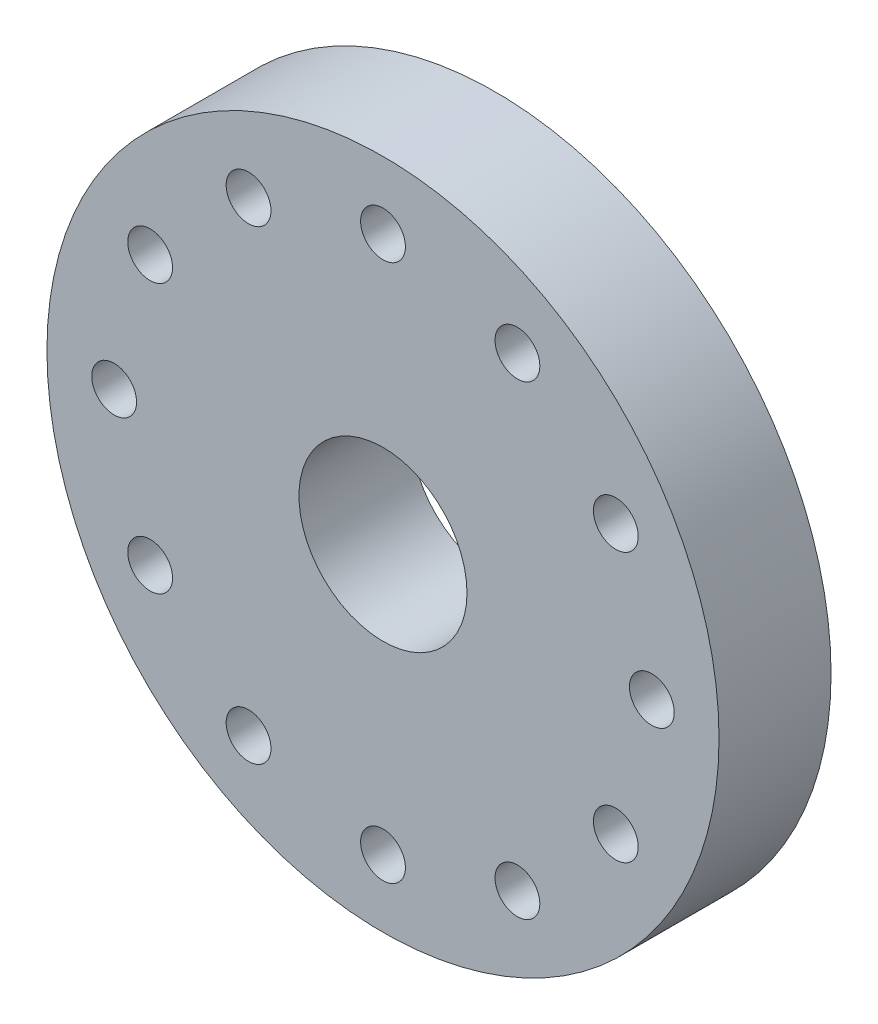
ISO-10303-21;
HEADER;
FILE_DESCRIPTION(('STEP AP214'),'2;1');
FILE_NAME('part.step','',(''),(''),'','','');
FILE_SCHEMA(('AUTOMOTIVE_DESIGN { 1 0 10303 214 1 1 1 1 }'));
ENDSEC;
DATA;
#1=APPLICATION_CONTEXT('core data for automotive mechanical design processes');
#2=APPLICATION_PROTOCOL_DEFINITION('international standard','automotive_design',2000,#1);
#3=PRODUCT_CONTEXT('',#1,'mechanical');
#4=PRODUCT('Part','Part','',(#3));
#5=PRODUCT_RELATED_PRODUCT_CATEGORY('part','',(#4));
#6=PRODUCT_DEFINITION_FORMATION('','',#4);
#7=PRODUCT_DEFINITION_CONTEXT('part definition',#1,'design');
#8=PRODUCT_DEFINITION('design','',#6,#7);
#9=PRODUCT_DEFINITION_SHAPE('','',#8);
#10=(LENGTH_UNIT() NAMED_UNIT(*) SI_UNIT(.MILLI.,.METRE.));
#11=(NAMED_UNIT(*) PLANE_ANGLE_UNIT() SI_UNIT($,.RADIAN.));
#12=(NAMED_UNIT(*) SI_UNIT($,.STERADIAN.) SOLID_ANGLE_UNIT());
#13=UNCERTAINTY_MEASURE_WITH_UNIT(LENGTH_MEASURE(1.E-05),#10,'distance_accuracy_value','');
#14=(GEOMETRIC_REPRESENTATION_CONTEXT(3) GLOBAL_UNCERTAINTY_ASSIGNED_CONTEXT((#13)) GLOBAL_UNIT_ASSIGNED_CONTEXT((#10,
#11,#12)) REPRESENTATION_CONTEXT('',''));
#15=CARTESIAN_POINT('',(0.,0.,0.));
#16=DIRECTION('',(0.,0.,1.));
#17=DIRECTION('',(1.,0.,0.));
#18=AXIS2_PLACEMENT_3D('',#15,#16,#17);
#19=CARTESIAN_POINT('',(0.,0.,10.));
#20=DIRECTION('',(0.,0.,-1.));
#21=DIRECTION('',(-1.,0.,0.));
#22=AXIS2_PLACEMENT_3D('',#19,#20,#21);
#23=CYLINDRICAL_SURFACE('',#22,30.);
#24=CARTESIAN_POINT('',(0.,0.,10.));
#25=DIRECTION('',(0.,0.,1.));
#26=DIRECTION('',(1.,0.,0.));
#27=AXIS2_PLACEMENT_3D('',#24,#25,#26);
#28=CIRCLE('',#27,30.);
#29=CARTESIAN_POINT('',(30.,0.,10.));
#30=VERTEX_POINT('',#29);
#31=EDGE_CURVE('E10',#30,#30,#28,.T.);
#32=ORIENTED_EDGE('',*,*,#31,.F.);
#33=EDGE_LOOP('',(#32));
#34=FACE_BOUND('',#33,.T.);
#35=CARTESIAN_POINT('',(0.,0.,0.));
#36=DIRECTION('',(0.,0.,1.));
#37=DIRECTION('',(1.,0.,0.));
#38=AXIS2_PLACEMENT_3D('',#35,#36,#37);
#39=CIRCLE('',#38,30.);
#40=CARTESIAN_POINT('',(30.,0.,0.));
#41=VERTEX_POINT('',#40);
#42=EDGE_CURVE('E53',#41,#41,#39,.T.);
#43=ORIENTED_EDGE('',*,*,#42,.T.);
#44=EDGE_LOOP('',(#43));
#45=FACE_BOUND('',#44,.T.);
#46=ADVANCED_FACE('F49',(#34,#45),#23,.T.);
#47=CARTESIAN_POINT('',(0.,0.,10.));
#48=DIRECTION('',(0.,0.,1.));
#49=DIRECTION('',(1.,0.,0.));
#50=AXIS2_PLACEMENT_3D('',#47,#48,#49);
#51=PLANE('',#50);
#52=CARTESIAN_POINT('',(-12.,-20.78461,10.));
#53=DIRECTION('',(0.,0.,1.));
#54=DIRECTION('',(1.,0.,0.));
#55=AXIS2_PLACEMENT_3D('',#52,#53,#54);
#56=CIRCLE('',#55,2.);
#57=CARTESIAN_POINT('',(-10.,-20.78461,10.));
#58=VERTEX_POINT('',#57);
#59=EDGE_CURVE('E113',#58,#58,#56,.T.);
#60=ORIENTED_EDGE('',*,*,#59,.F.);
#61=EDGE_LOOP('',(#60));
#62=FACE_BOUND('',#61,.T.);
#63=CARTESIAN_POINT('',(-20.78461,-12.,10.));
#64=DIRECTION('',(0.,0.,1.));
#65=DIRECTION('',(1.,0.,0.));
#66=AXIS2_PLACEMENT_3D('',#63,#64,#65);
#67=CIRCLE('',#66,2.);
#68=CARTESIAN_POINT('',(-18.78461,-12.,10.));
#69=VERTEX_POINT('',#68);
#70=EDGE_CURVE('E122',#69,#69,#67,.T.);
#71=ORIENTED_EDGE('',*,*,#70,.F.);
#72=EDGE_LOOP('',(#71));
#73=FACE_BOUND('',#72,.T.);
#74=CARTESIAN_POINT('',(-24.,0.,10.));
#75=DIRECTION('',(0.,0.,1.));
#76=DIRECTION('',(1.,0.,0.));
#77=AXIS2_PLACEMENT_3D('',#74,#75,#76);
#78=CIRCLE('',#77,2.);
#79=CARTESIAN_POINT('',(-22.,0.,10.));
#80=VERTEX_POINT('',#79);
#81=EDGE_CURVE('E129',#80,#80,#78,.T.);
#82=ORIENTED_EDGE('',*,*,#81,.F.);
#83=EDGE_LOOP('',(#82));
#84=FACE_BOUND('',#83,.T.);
#85=CARTESIAN_POINT('',(-20.78461,12.,10.));
#86=DIRECTION('',(0.,0.,1.));
#87=DIRECTION('',(1.,0.,0.));
#88=AXIS2_PLACEMENT_3D('',#85,#86,#87);
#89=CIRCLE('',#88,2.);
#90=CARTESIAN_POINT('',(-18.78461,12.,10.));
#91=VERTEX_POINT('',#90);
#92=EDGE_CURVE('E137',#91,#91,#89,.T.);
#93=ORIENTED_EDGE('',*,*,#92,.F.);
#94=EDGE_LOOP('',(#93));
#95=FACE_BOUND('',#94,.T.);
#96=CARTESIAN_POINT('',(-12.,20.78461,10.));
#97=DIRECTION('',(0.,0.,1.));
#98=DIRECTION('',(1.,0.,0.));
#99=AXIS2_PLACEMENT_3D('',#96,#97,#98);
#100=CIRCLE('',#99,2.);
#101=CARTESIAN_POINT('',(-10.,20.78461,10.));
#102=VERTEX_POINT('',#101);
#103=EDGE_CURVE('E81',#102,#102,#100,.T.);
#104=ORIENTED_EDGE('',*,*,#103,.F.);
#105=EDGE_LOOP('',(#104));
#106=FACE_BOUND('',#105,.T.);
#107=CARTESIAN_POINT('',(0.,24.,10.));
#108=DIRECTION('',(0.,0.,1.));
#109=DIRECTION('',(1.,0.,0.));
#110=AXIS2_PLACEMENT_3D('',#107,#108,#109);
#111=CIRCLE('',#110,2.);
#112=CARTESIAN_POINT('',(2.,24.,10.));
#113=VERTEX_POINT('',#112);
#114=EDGE_CURVE('E90',#113,#113,#111,.T.);
#115=ORIENTED_EDGE('',*,*,#114,.F.);
#116=EDGE_LOOP('',(#115));
#117=FACE_BOUND('',#116,.T.);
#118=CARTESIAN_POINT('',(12.,20.78461,10.));
#119=DIRECTION('',(0.,0.,1.));
#120=DIRECTION('',(1.,0.,0.));
#121=AXIS2_PLACEMENT_3D('',#118,#119,#120);
#122=CIRCLE('',#121,2.);
#123=CARTESIAN_POINT('',(14.,20.78461,10.));
#124=VERTEX_POINT('',#123);
#125=EDGE_CURVE('E98',#124,#124,#122,.T.);
#126=ORIENTED_EDGE('',*,*,#125,.F.);
#127=EDGE_LOOP('',(#126));
#128=FACE_BOUND('',#127,.T.);
#129=CARTESIAN_POINT('',(20.78461,12.,10.));
#130=DIRECTION('',(0.,0.,1.));
#131=DIRECTION('',(1.,0.,0.));
#132=AXIS2_PLACEMENT_3D('',#129,#130,#131);
#133=CIRCLE('',#132,2.);
#134=CARTESIAN_POINT('',(22.78461,12.,10.));
#135=VERTEX_POINT('',#134);
#136=EDGE_CURVE('E106',#135,#135,#133,.T.);
#137=ORIENTED_EDGE('',*,*,#136,.F.);
#138=EDGE_LOOP('',(#137));
#139=FACE_BOUND('',#138,.T.);
#140=CARTESIAN_POINT('',(0.,-24.,10.));
#141=DIRECTION('',(0.,0.,1.));
#142=DIRECTION('',(1.,0.,0.));
#143=AXIS2_PLACEMENT_3D('',#140,#141,#142);
#144=CIRCLE('',#143,2.);
#145=CARTESIAN_POINT('',(2.,-24.,10.));
#146=VERTEX_POINT('',#145);
#147=EDGE_CURVE('E160',#146,#146,#144,.T.);
#148=ORIENTED_EDGE('',*,*,#147,.F.);
#149=EDGE_LOOP('',(#148));
#150=FACE_BOUND('',#149,.T.);
#151=CARTESIAN_POINT('',(12.,-20.78461,10.));
#152=DIRECTION('',(0.,0.,1.));
#153=DIRECTION('',(1.,0.,0.));
#154=AXIS2_PLACEMENT_3D('',#151,#152,#153);
#155=CIRCLE('',#154,2.);
#156=CARTESIAN_POINT('',(14.,-20.78461,10.));
#157=VERTEX_POINT('',#156);
#158=EDGE_CURVE('E152',#157,#157,#155,.T.);
#159=ORIENTED_EDGE('',*,*,#158,.F.);
#160=EDGE_LOOP('',(#159));
#161=FACE_BOUND('',#160,.T.);
#162=CARTESIAN_POINT('',(20.78461,-12.,10.));
#163=DIRECTION('',(0.,0.,1.));
#164=DIRECTION('',(1.,0.,0.));
#165=AXIS2_PLACEMENT_3D('',#162,#163,#164);
#166=CIRCLE('',#165,2.);
#167=CARTESIAN_POINT('',(22.78461,-12.,10.));
#168=VERTEX_POINT('',#167);
#169=EDGE_CURVE('E144',#168,#168,#166,.T.);
#170=ORIENTED_EDGE('',*,*,#169,.F.);
#171=EDGE_LOOP('',(#170));
#172=FACE_BOUND('',#171,.T.);
#173=CARTESIAN_POINT('',(24.,0.,10.));
#174=DIRECTION('',(0.,0.,1.));
#175=DIRECTION('',(1.,0.,0.));
#176=AXIS2_PLACEMENT_3D('',#173,#174,#175);
#177=CIRCLE('',#176,2.);
#178=CARTESIAN_POINT('',(26.,0.,10.));
#179=VERTEX_POINT('',#178);
#180=EDGE_CURVE('E69',#179,#179,#177,.T.);
#181=ORIENTED_EDGE('',*,*,#180,.F.);
#182=EDGE_LOOP('',(#181));
#183=FACE_BOUND('',#182,.T.);
#184=CARTESIAN_POINT('',(0.,0.,10.));
#185=DIRECTION('',(0.,0.,1.));
#186=DIRECTION('',(1.,0.,0.));
#187=AXIS2_PLACEMENT_3D('',#184,#185,#186);
#188=CIRCLE('',#187,7.5);
#189=CARTESIAN_POINT('',(7.5,0.,10.));
#190=VERTEX_POINT('',#189);
#191=EDGE_CURVE('E63',#190,#190,#188,.T.);
#192=ORIENTED_EDGE('',*,*,#191,.F.);
#193=EDGE_LOOP('',(#192));
#194=FACE_BOUND('',#193,.T.);
#195=ORIENTED_EDGE('',*,*,#31,.T.);
#196=EDGE_LOOP('',(#195));
#197=FACE_BOUND('',#196,.T.);
#198=ADVANCED_FACE('F188',(#62,#73,#84,#95,#106,#117,#128,#139,#150,#161,#172,#183,#194,#197),
#51,.T.);
#199=CARTESIAN_POINT('',(0.,0.,0.));
#200=DIRECTION('',(0.,0.,1.));
#201=DIRECTION('',(1.,0.,0.));
#202=AXIS2_PLACEMENT_3D('',#199,#200,#201);
#203=PLANE('',#202);
#204=CARTESIAN_POINT('',(-12.,-20.78461,0.));
#205=DIRECTION('',(0.,0.,1.));
#206=DIRECTION('',(1.,0.,0.));
#207=AXIS2_PLACEMENT_3D('',#204,#205,#206);
#208=CIRCLE('',#207,2.);
#209=CARTESIAN_POINT('',(-10.,-20.78461,0.));
#210=VERTEX_POINT('',#209);
#211=EDGE_CURVE('E117',#210,#210,#208,.T.);
#212=ORIENTED_EDGE('',*,*,#211,.T.);
#213=EDGE_LOOP('',(#212));
#214=FACE_BOUND('',#213,.T.);
#215=CARTESIAN_POINT('',(-20.78461,-12.,0.));
#216=DIRECTION('',(0.,0.,1.));
#217=DIRECTION('',(1.,0.,0.));
#218=AXIS2_PLACEMENT_3D('',#215,#216,#217);
#219=CIRCLE('',#218,2.);
#220=CARTESIAN_POINT('',(-18.78461,-12.,0.));
#221=VERTEX_POINT('',#220);
#222=EDGE_CURVE('E126',#221,#221,#219,.T.);
#223=ORIENTED_EDGE('',*,*,#222,.T.);
#224=EDGE_LOOP('',(#223));
#225=FACE_BOUND('',#224,.T.);
#226=CARTESIAN_POINT('',(-24.,0.,0.));
#227=DIRECTION('',(0.,0.,1.));
#228=DIRECTION('',(1.,0.,0.));
#229=AXIS2_PLACEMENT_3D('',#226,#227,#228);
#230=CIRCLE('',#229,2.);
#231=CARTESIAN_POINT('',(-22.,0.,0.));
#232=VERTEX_POINT('',#231);
#233=EDGE_CURVE('E133',#232,#232,#230,.T.);
#234=ORIENTED_EDGE('',*,*,#233,.T.);
#235=EDGE_LOOP('',(#234));
#236=FACE_BOUND('',#235,.T.);
#237=CARTESIAN_POINT('',(-20.78461,12.,0.));
#238=DIRECTION('',(0.,0.,1.));
#239=DIRECTION('',(1.,0.,0.));
#240=AXIS2_PLACEMENT_3D('',#237,#238,#239);
#241=CIRCLE('',#240,2.);
#242=CARTESIAN_POINT('',(-18.78461,12.,0.));
#243=VERTEX_POINT('',#242);
#244=EDGE_CURVE('E86',#243,#243,#241,.T.);
#245=ORIENTED_EDGE('',*,*,#244,.T.);
#246=EDGE_LOOP('',(#245));
#247=FACE_BOUND('',#246,.T.);
#248=CARTESIAN_POINT('',(-12.,20.78461,0.));
#249=DIRECTION('',(0.,0.,1.));
#250=DIRECTION('',(1.,0.,0.));
#251=AXIS2_PLACEMENT_3D('',#248,#249,#250);
#252=CIRCLE('',#251,2.);
#253=CARTESIAN_POINT('',(-10.,20.78461,0.));
#254=VERTEX_POINT('',#253);
#255=EDGE_CURVE('E85',#254,#254,#252,.T.);
#256=ORIENTED_EDGE('',*,*,#255,.T.);
#257=EDGE_LOOP('',(#256));
#258=FACE_BOUND('',#257,.T.);
#259=CARTESIAN_POINT('',(0.,24.,0.));
#260=DIRECTION('',(0.,0.,1.));
#261=DIRECTION('',(1.,0.,0.));
#262=AXIS2_PLACEMENT_3D('',#259,#260,#261);
#263=CIRCLE('',#262,2.);
#264=CARTESIAN_POINT('',(2.,24.,0.));
#265=VERTEX_POINT('',#264);
#266=EDGE_CURVE('E94',#265,#265,#263,.T.);
#267=ORIENTED_EDGE('',*,*,#266,.T.);
#268=EDGE_LOOP('',(#267));
#269=FACE_BOUND('',#268,.T.);
#270=CARTESIAN_POINT('',(12.,20.78461,0.));
#271=DIRECTION('',(0.,0.,1.));
#272=DIRECTION('',(1.,0.,0.));
#273=AXIS2_PLACEMENT_3D('',#270,#271,#272);
#274=CIRCLE('',#273,2.);
#275=CARTESIAN_POINT('',(14.,20.78461,0.));
#276=VERTEX_POINT('',#275);
#277=EDGE_CURVE('E102',#276,#276,#274,.T.);
#278=ORIENTED_EDGE('',*,*,#277,.T.);
#279=EDGE_LOOP('',(#278));
#280=FACE_BOUND('',#279,.T.);
#281=CARTESIAN_POINT('',(20.78461,12.,0.));
#282=DIRECTION('',(0.,0.,1.));
#283=DIRECTION('',(1.,0.,0.));
#284=AXIS2_PLACEMENT_3D('',#281,#282,#283);
#285=CIRCLE('',#284,2.);
#286=CARTESIAN_POINT('',(22.78461,12.,0.));
#287=VERTEX_POINT('',#286);
#288=EDGE_CURVE('E77',#287,#287,#285,.T.);
#289=ORIENTED_EDGE('',*,*,#288,.T.);
#290=EDGE_LOOP('',(#289));
#291=FACE_BOUND('',#290,.T.);
#292=CARTESIAN_POINT('',(0.,-24.,0.));
#293=DIRECTION('',(0.,0.,1.));
#294=DIRECTION('',(1.,0.,0.));
#295=AXIS2_PLACEMENT_3D('',#292,#293,#294);
#296=CIRCLE('',#295,2.);
#297=CARTESIAN_POINT('',(2.,-24.,0.));
#298=VERTEX_POINT('',#297);
#299=EDGE_CURVE('E118',#298,#298,#296,.T.);
#300=ORIENTED_EDGE('',*,*,#299,.T.);
#301=EDGE_LOOP('',(#300));
#302=FACE_BOUND('',#301,.T.);
#303=CARTESIAN_POINT('',(12.,-20.78461,0.));
#304=DIRECTION('',(0.,0.,1.));
#305=DIRECTION('',(1.,0.,0.));
#306=AXIS2_PLACEMENT_3D('',#303,#304,#305);
#307=CIRCLE('',#306,2.);
#308=CARTESIAN_POINT('',(14.,-20.78461,0.));
#309=VERTEX_POINT('',#308);
#310=EDGE_CURVE('E156',#309,#309,#307,.T.);
#311=ORIENTED_EDGE('',*,*,#310,.T.);
#312=EDGE_LOOP('',(#311));
#313=FACE_BOUND('',#312,.T.);
#314=CARTESIAN_POINT('',(20.78461,-12.,0.));
#315=DIRECTION('',(0.,0.,1.));
#316=DIRECTION('',(1.,0.,0.));
#317=AXIS2_PLACEMENT_3D('',#314,#315,#316);
#318=CIRCLE('',#317,2.);
#319=CARTESIAN_POINT('',(22.78461,-12.,0.));
#320=VERTEX_POINT('',#319);
#321=EDGE_CURVE('E148',#320,#320,#318,.T.);
#322=ORIENTED_EDGE('',*,*,#321,.T.);
#323=EDGE_LOOP('',(#322));
#324=FACE_BOUND('',#323,.T.);
#325=CARTESIAN_POINT('',(24.,0.,0.));
#326=DIRECTION('',(0.,0.,1.));
#327=DIRECTION('',(1.,0.,0.));
#328=AXIS2_PLACEMENT_3D('',#325,#326,#327);
#329=CIRCLE('',#328,2.);
#330=CARTESIAN_POINT('',(26.,0.,0.));
#331=VERTEX_POINT('',#330);
#332=EDGE_CURVE('E73',#331,#331,#329,.T.);
#333=ORIENTED_EDGE('',*,*,#332,.T.);
#334=EDGE_LOOP('',(#333));
#335=FACE_BOUND('',#334,.T.);
#336=CARTESIAN_POINT('',(0.,0.,0.));
#337=DIRECTION('',(0.,0.,1.));
#338=DIRECTION('',(1.,0.,0.));
#339=AXIS2_PLACEMENT_3D('',#336,#337,#338);
#340=CIRCLE('',#339,7.5);
#341=CARTESIAN_POINT('',(7.5,0.,0.));
#342=VERTEX_POINT('',#341);
#343=EDGE_CURVE('E65',#342,#342,#340,.T.);
#344=ORIENTED_EDGE('',*,*,#343,.T.);
#345=EDGE_LOOP('',(#344));
#346=FACE_BOUND('',#345,.T.);
#347=ORIENTED_EDGE('',*,*,#42,.F.);
#348=EDGE_LOOP('',(#347));
#349=FACE_BOUND('',#348,.T.);
#350=ADVANCED_FACE('F168',(#214,#225,#236,#247,#258,#269,#280,#291,#302,#313,#324,#335,#346,
#349),#203,.F.);
#351=CARTESIAN_POINT('',(0.,0.,10.));
#352=DIRECTION('',(0.,0.,-1.));
#353=DIRECTION('',(-1.,0.,0.));
#354=AXIS2_PLACEMENT_3D('',#351,#352,#353);
#355=CYLINDRICAL_SURFACE('',#354,7.5);
#356=ORIENTED_EDGE('',*,*,#191,.T.);
#357=EDGE_LOOP('',(#356));
#358=FACE_BOUND('',#357,.T.);
#359=ORIENTED_EDGE('',*,*,#343,.F.);
#360=EDGE_LOOP('',(#359));
#361=FACE_BOUND('',#360,.T.);
#362=ADVANCED_FACE('F198',(#358,#361),#355,.F.);
#363=CARTESIAN_POINT('',(24.,0.,10.));
#364=DIRECTION('',(0.,0.,-1.));
#365=DIRECTION('',(-1.,0.,0.));
#366=AXIS2_PLACEMENT_3D('',#363,#364,#365);
#367=CYLINDRICAL_SURFACE('',#366,2.);
#368=ORIENTED_EDGE('',*,*,#180,.T.);
#369=EDGE_LOOP('',(#368));
#370=FACE_BOUND('',#369,.T.);
#371=ORIENTED_EDGE('',*,*,#332,.F.);
#372=EDGE_LOOP('',(#371));
#373=FACE_BOUND('',#372,.T.);
#374=ADVANCED_FACE('F202',(#370,#373),#367,.F.);
#375=CARTESIAN_POINT('',(20.78461,-12.,10.));
#376=DIRECTION('',(0.,0.,-1.));
#377=DIRECTION('',(-1.,0.,0.));
#378=AXIS2_PLACEMENT_3D('',#375,#376,#377);
#379=CYLINDRICAL_SURFACE('',#378,2.);
#380=ORIENTED_EDGE('',*,*,#169,.T.);
#381=EDGE_LOOP('',(#380));
#382=FACE_BOUND('',#381,.T.);
#383=ORIENTED_EDGE('',*,*,#321,.F.);
#384=EDGE_LOOP('',(#383));
#385=FACE_BOUND('',#384,.T.);
#386=ADVANCED_FACE('F183',(#382,#385),#379,.F.);
#387=CARTESIAN_POINT('',(12.,-20.78461,10.));
#388=DIRECTION('',(0.,0.,-1.));
#389=DIRECTION('',(-1.,0.,0.));
#390=AXIS2_PLACEMENT_3D('',#387,#388,#389);
#391=CYLINDRICAL_SURFACE('',#390,2.);
#392=ORIENTED_EDGE('',*,*,#158,.T.);
#393=EDGE_LOOP('',(#392));
#394=FACE_BOUND('',#393,.T.);
#395=ORIENTED_EDGE('',*,*,#310,.F.);
#396=EDGE_LOOP('',(#395));
#397=FACE_BOUND('',#396,.T.);
#398=ADVANCED_FACE('F174',(#394,#397),#391,.F.);
#399=CARTESIAN_POINT('',(0.,-24.,10.));
#400=DIRECTION('',(0.,0.,-1.));
#401=DIRECTION('',(-1.,0.,0.));
#402=AXIS2_PLACEMENT_3D('',#399,#400,#401);
#403=CYLINDRICAL_SURFACE('',#402,2.);
#404=ORIENTED_EDGE('',*,*,#147,.T.);
#405=EDGE_LOOP('',(#404));
#406=FACE_BOUND('',#405,.T.);
#407=ORIENTED_EDGE('',*,*,#299,.F.);
#408=EDGE_LOOP('',(#407));
#409=FACE_BOUND('',#408,.T.);
#410=ADVANCED_FACE('F171',(#406,#409),#403,.F.);
#411=CARTESIAN_POINT('',(20.78461,12.,10.));
#412=DIRECTION('',(0.,0.,-1.));
#413=DIRECTION('',(-1.,0.,0.));
#414=AXIS2_PLACEMENT_3D('',#411,#412,#413);
#415=CYLINDRICAL_SURFACE('',#414,2.);
#416=ORIENTED_EDGE('',*,*,#136,.T.);
#417=EDGE_LOOP('',(#416));
#418=FACE_BOUND('',#417,.T.);
#419=ORIENTED_EDGE('',*,*,#288,.F.);
#420=EDGE_LOOP('',(#419));
#421=FACE_BOUND('',#420,.T.);
#422=ADVANCED_FACE('F173',(#418,#421),#415,.F.);
#423=CARTESIAN_POINT('',(12.,20.78461,10.));
#424=DIRECTION('',(0.,0.,-1.));
#425=DIRECTION('',(-1.,0.,0.));
#426=AXIS2_PLACEMENT_3D('',#423,#424,#425);
#427=CYLINDRICAL_SURFACE('',#426,2.);
#428=ORIENTED_EDGE('',*,*,#125,.T.);
#429=EDGE_LOOP('',(#428));
#430=FACE_BOUND('',#429,.T.);
#431=ORIENTED_EDGE('',*,*,#277,.F.);
#432=EDGE_LOOP('',(#431));
#433=FACE_BOUND('',#432,.T.);
#434=ADVANCED_FACE('F180',(#430,#433),#427,.F.);
#435=CARTESIAN_POINT('',(0.,24.,10.));
#436=DIRECTION('',(0.,0.,-1.));
#437=DIRECTION('',(-1.,0.,0.));
#438=AXIS2_PLACEMENT_3D('',#435,#436,#437);
#439=CYLINDRICAL_SURFACE('',#438,2.);
#440=ORIENTED_EDGE('',*,*,#114,.T.);
#441=EDGE_LOOP('',(#440));
#442=FACE_BOUND('',#441,.T.);
#443=ORIENTED_EDGE('',*,*,#266,.F.);
#444=EDGE_LOOP('',(#443));
#445=FACE_BOUND('',#444,.T.);
#446=ADVANCED_FACE('F222',(#442,#445),#439,.F.);
#447=CARTESIAN_POINT('',(-12.,20.78461,10.));
#448=DIRECTION('',(0.,0.,-1.));
#449=DIRECTION('',(-1.,0.,0.));
#450=AXIS2_PLACEMENT_3D('',#447,#448,#449);
#451=CYLINDRICAL_SURFACE('',#450,2.);
#452=ORIENTED_EDGE('',*,*,#103,.T.);
#453=EDGE_LOOP('',(#452));
#454=FACE_BOUND('',#453,.T.);
#455=ORIENTED_EDGE('',*,*,#255,.F.);
#456=EDGE_LOOP('',(#455));
#457=FACE_BOUND('',#456,.T.);
#458=ADVANCED_FACE('F216',(#454,#457),#451,.F.);
#459=CARTESIAN_POINT('',(-20.78461,12.,10.));
#460=DIRECTION('',(0.,0.,-1.));
#461=DIRECTION('',(-1.,0.,0.));
#462=AXIS2_PLACEMENT_3D('',#459,#460,#461);
#463=CYLINDRICAL_SURFACE('',#462,2.);
#464=ORIENTED_EDGE('',*,*,#92,.T.);
#465=EDGE_LOOP('',(#464));
#466=FACE_BOUND('',#465,.T.);
#467=ORIENTED_EDGE('',*,*,#244,.F.);
#468=EDGE_LOOP('',(#467));
#469=FACE_BOUND('',#468,.T.);
#470=ADVANCED_FACE('F221',(#466,#469),#463,.F.);
#471=CARTESIAN_POINT('',(-24.,0.,10.));
#472=DIRECTION('',(0.,0.,-1.));
#473=DIRECTION('',(-1.,0.,0.));
#474=AXIS2_PLACEMENT_3D('',#471,#472,#473);
#475=CYLINDRICAL_SURFACE('',#474,2.);
#476=ORIENTED_EDGE('',*,*,#81,.T.);
#477=EDGE_LOOP('',(#476));
#478=FACE_BOUND('',#477,.T.);
#479=ORIENTED_EDGE('',*,*,#233,.F.);
#480=EDGE_LOOP('',(#479));
#481=FACE_BOUND('',#480,.T.);
#482=ADVANCED_FACE('F242',(#478,#481),#475,.F.);
#483=CARTESIAN_POINT('',(-20.78461,-12.,10.));
#484=DIRECTION('',(0.,0.,-1.));
#485=DIRECTION('',(-1.,0.,0.));
#486=AXIS2_PLACEMENT_3D('',#483,#484,#485);
#487=CYLINDRICAL_SURFACE('',#486,2.);
#488=ORIENTED_EDGE('',*,*,#70,.T.);
#489=EDGE_LOOP('',(#488));
#490=FACE_BOUND('',#489,.T.);
#491=ORIENTED_EDGE('',*,*,#222,.F.);
#492=EDGE_LOOP('',(#491));
#493=FACE_BOUND('',#492,.T.);
#494=ADVANCED_FACE('F237',(#490,#493),#487,.F.);
#495=CARTESIAN_POINT('',(-12.,-20.78461,10.));
#496=DIRECTION('',(0.,0.,-1.));
#497=DIRECTION('',(-1.,0.,0.));
#498=AXIS2_PLACEMENT_3D('',#495,#496,#497);
#499=CYLINDRICAL_SURFACE('',#498,2.);
#500=ORIENTED_EDGE('',*,*,#59,.T.);
#501=EDGE_LOOP('',(#500));
#502=FACE_BOUND('',#501,.T.);
#503=ORIENTED_EDGE('',*,*,#211,.F.);
#504=EDGE_LOOP('',(#503));
#505=FACE_BOUND('',#504,.T.);
#506=ADVANCED_FACE('F233',(#502,#505),#499,.F.);
#507=CLOSED_SHELL('',(#46,#198,#350,#362,#374,#386,#398,#410,#422,#434,#446,#458,#470,#482,#494,#506));
#508=MANIFOLD_SOLID_BREP('B2',#507);
#509=ADVANCED_BREP_SHAPE_REPRESENTATION('',(#18,#508),#14);
#510=SHAPE_DEFINITION_REPRESENTATION(#9,#509);
ENDSEC;
END-ISO-10303-21;
